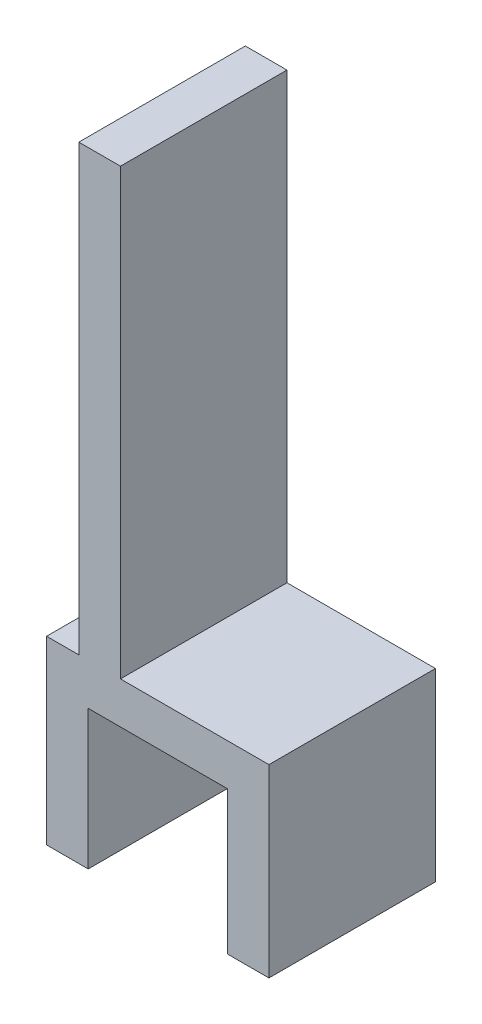
ISO-10303-21;
HEADER;
FILE_DESCRIPTION(('STEP AP214'),'2;1');
FILE_NAME('part.step','',(''),(''),'','','');
FILE_SCHEMA(('AUTOMOTIVE_DESIGN { 1 0 10303 214 1 1 1 1 }'));
ENDSEC;
DATA;
#1=APPLICATION_CONTEXT('core data for automotive mechanical design processes');
#2=APPLICATION_PROTOCOL_DEFINITION('international standard','automotive_design',2000,#1);
#3=PRODUCT_CONTEXT('',#1,'mechanical');
#4=PRODUCT('Part','Part','',(#3));
#5=PRODUCT_RELATED_PRODUCT_CATEGORY('part','',(#4));
#6=PRODUCT_DEFINITION_FORMATION('','',#4);
#7=PRODUCT_DEFINITION_CONTEXT('part definition',#1,'design');
#8=PRODUCT_DEFINITION('design','',#6,#7);
#9=PRODUCT_DEFINITION_SHAPE('','',#8);
#10=(LENGTH_UNIT() NAMED_UNIT(*) SI_UNIT(.MILLI.,.METRE.));
#11=(NAMED_UNIT(*) PLANE_ANGLE_UNIT() SI_UNIT($,.RADIAN.));
#12=(NAMED_UNIT(*) SI_UNIT($,.STERADIAN.) SOLID_ANGLE_UNIT());
#13=UNCERTAINTY_MEASURE_WITH_UNIT(LENGTH_MEASURE(1.E-05),#10,'distance_accuracy_value','');
#14=(GEOMETRIC_REPRESENTATION_CONTEXT(3) GLOBAL_UNCERTAINTY_ASSIGNED_CONTEXT((#13)) GLOBAL_UNIT_ASSIGNED_CONTEXT((#10,
#11,#12)) REPRESENTATION_CONTEXT('',''));
#15=CARTESIAN_POINT('',(0.,0.,0.));
#16=DIRECTION('',(0.,0.,1.));
#17=DIRECTION('',(1.,0.,0.));
#18=AXIS2_PLACEMENT_3D('',#15,#16,#17);
#19=CARTESIAN_POINT('',(3.00000000000001,-13.025,12.));
#20=DIRECTION('',(0.,1.,0.));
#21=DIRECTION('',(0.,0.,1.));
#22=AXIS2_PLACEMENT_3D('',#19,#20,#21);
#23=PLANE('',#22);
#24=DIRECTION('',(1.,0.,0.));
#25=VECTOR('',#24,1.);
#26=CARTESIAN_POINT('',(3.00000000000001,-13.025,0.));
#27=LINE('',#26,#25);
#28=CARTESIAN_POINT('',(0.,-13.025,0.));
#29=VERTEX_POINT('',#28);
#30=CARTESIAN_POINT('',(3.00000000000001,-13.025,0.));
#31=VERTEX_POINT('',#30);
#32=EDGE_CURVE('E156',#29,#31,#27,.T.);
#33=ORIENTED_EDGE('',*,*,#32,.T.);
#34=DIRECTION('',(0.,0.,-1.));
#35=VECTOR('',#34,1.);
#36=CARTESIAN_POINT('',(3.00000000000001,-13.025,12.));
#37=LINE('',#36,#35);
#38=CARTESIAN_POINT('',(3.00000000000001,-13.025,12.));
#39=VERTEX_POINT('',#38);
#40=EDGE_CURVE('E11',#39,#31,#37,.T.);
#41=ORIENTED_EDGE('',*,*,#40,.F.);
#42=DIRECTION('',(1.,0.,0.));
#43=VECTOR('',#42,1.);
#44=CARTESIAN_POINT('',(3.00000000000001,-13.025,12.));
#45=LINE('',#44,#43);
#46=CARTESIAN_POINT('',(0.,-13.025,12.));
#47=VERTEX_POINT('',#46);
#48=EDGE_CURVE('E178',#47,#39,#45,.T.);
#49=ORIENTED_EDGE('',*,*,#48,.F.);
#50=DIRECTION('',(0.,0.,-1.));
#51=VECTOR('',#50,1.);
#52=CARTESIAN_POINT('',(0.,-13.025,12.));
#53=LINE('',#52,#51);
#54=EDGE_CURVE('E152',#47,#29,#53,.T.);
#55=ORIENTED_EDGE('',*,*,#54,.T.);
#56=EDGE_LOOP('',(#33,#41,#49,#55));
#57=FACE_BOUND('',#56,.T.);
#58=ADVANCED_FACE('F36',(#57),#23,.F.);
#59=CARTESIAN_POINT('',(3.,-3.,12.));
#60=DIRECTION('',(-1.,0.,0.));
#61=DIRECTION('',(0.,-1.,0.));
#62=AXIS2_PLACEMENT_3D('',#59,#60,#61);
#63=PLANE('',#62);
#64=DIRECTION('',(0.,1.,0.));
#65=VECTOR('',#64,1.);
#66=CARTESIAN_POINT('',(3.,-3.,0.));
#67=LINE('',#66,#65);
#68=CARTESIAN_POINT('',(3.,-3.,0.));
#69=VERTEX_POINT('',#68);
#70=EDGE_CURVE('E159',#31,#69,#67,.T.);
#71=ORIENTED_EDGE('',*,*,#70,.T.);
#72=DIRECTION('',(0.,0.,-1.));
#73=VECTOR('',#72,1.);
#74=CARTESIAN_POINT('',(3.,-3.,12.));
#75=LINE('',#74,#73);
#76=CARTESIAN_POINT('',(3.,-3.,12.));
#77=VERTEX_POINT('',#76);
#78=EDGE_CURVE('E44',#77,#69,#75,.T.);
#79=ORIENTED_EDGE('',*,*,#78,.F.);
#80=DIRECTION('',(0.,1.,0.));
#81=VECTOR('',#80,1.);
#82=CARTESIAN_POINT('',(3.,-3.,12.));
#83=LINE('',#82,#81);
#84=EDGE_CURVE('E107',#39,#77,#83,.T.);
#85=ORIENTED_EDGE('',*,*,#84,.F.);
#86=ORIENTED_EDGE('',*,*,#40,.T.);
#87=EDGE_LOOP('',(#71,#79,#85,#86));
#88=FACE_BOUND('',#87,.T.);
#89=ADVANCED_FACE('F256',(#88),#63,.F.);
#90=CARTESIAN_POINT('',(13.025,-3.,12.));
#91=DIRECTION('',(0.,1.,0.));
#92=DIRECTION('',(-1.,0.,0.));
#93=AXIS2_PLACEMENT_3D('',#90,#91,#92);
#94=PLANE('',#93);
#95=DIRECTION('',(1.,0.,0.));
#96=VECTOR('',#95,1.);
#97=CARTESIAN_POINT('',(13.025,-3.,0.));
#98=LINE('',#97,#96);
#99=CARTESIAN_POINT('',(13.025,-3.,0.));
#100=VERTEX_POINT('',#99);
#101=EDGE_CURVE('E161',#69,#100,#98,.T.);
#102=ORIENTED_EDGE('',*,*,#101,.T.);
#103=DIRECTION('',(0.,0.,-1.));
#104=VECTOR('',#103,1.);
#105=CARTESIAN_POINT('',(13.025,-3.,12.));
#106=LINE('',#105,#104);
#107=CARTESIAN_POINT('',(13.025,-3.,12.));
#108=VERTEX_POINT('',#107);
#109=EDGE_CURVE('E197',#108,#100,#106,.T.);
#110=ORIENTED_EDGE('',*,*,#109,.F.);
#111=DIRECTION('',(1.,0.,0.));
#112=VECTOR('',#111,1.);
#113=CARTESIAN_POINT('',(13.025,-3.,12.));
#114=LINE('',#113,#112);
#115=EDGE_CURVE('E205',#77,#108,#114,.T.);
#116=ORIENTED_EDGE('',*,*,#115,.F.);
#117=ORIENTED_EDGE('',*,*,#78,.T.);
#118=EDGE_LOOP('',(#102,#110,#116,#117));
#119=FACE_BOUND('',#118,.T.);
#120=ADVANCED_FACE('F203',(#119),#94,.F.);
#121=CARTESIAN_POINT('',(13.025,-13.3169902912621,12.));
#122=DIRECTION('',(1.,0.,0.));
#123=DIRECTION('',(0.,0.,-1.));
#124=AXIS2_PLACEMENT_3D('',#121,#122,#123);
#125=PLANE('',#124);
#126=DIRECTION('',(0.,-1.,0.));
#127=VECTOR('',#126,1.);
#128=CARTESIAN_POINT('',(13.025,-13.3169902912621,0.));
#129=LINE('',#128,#127);
#130=CARTESIAN_POINT('',(13.025,-13.3169902912621,0.));
#131=VERTEX_POINT('',#130);
#132=EDGE_CURVE('E163',#100,#131,#129,.T.);
#133=ORIENTED_EDGE('',*,*,#132,.T.);
#134=DIRECTION('',(0.,0.,-1.));
#135=VECTOR('',#134,1.);
#136=CARTESIAN_POINT('',(13.025,-13.3169902912621,12.));
#137=LINE('',#136,#135);
#138=CARTESIAN_POINT('',(13.025,-13.3169902912621,12.));
#139=VERTEX_POINT('',#138);
#140=EDGE_CURVE('E194',#139,#131,#137,.T.);
#141=ORIENTED_EDGE('',*,*,#140,.F.);
#142=DIRECTION('',(0.,-1.,0.));
#143=VECTOR('',#142,1.);
#144=CARTESIAN_POINT('',(13.025,-13.3169902912621,12.));
#145=LINE('',#144,#143);
#146=EDGE_CURVE('E223',#108,#139,#145,.T.);
#147=ORIENTED_EDGE('',*,*,#146,.F.);
#148=ORIENTED_EDGE('',*,*,#109,.T.);
#149=EDGE_LOOP('',(#133,#141,#147,#148));
#150=FACE_BOUND('',#149,.T.);
#151=ADVANCED_FACE('F214',(#150),#125,.F.);
#152=CARTESIAN_POINT('',(16.025,-13.3169902912621,12.));
#153=DIRECTION('',(0.,1.,0.));
#154=DIRECTION('',(0.,0.,1.));
#155=AXIS2_PLACEMENT_3D('',#152,#153,#154);
#156=PLANE('',#155);
#157=DIRECTION('',(1.,0.,0.));
#158=VECTOR('',#157,1.);
#159=CARTESIAN_POINT('',(16.025,-13.3169902912621,0.));
#160=LINE('',#159,#158);
#161=CARTESIAN_POINT('',(16.025,-13.3169902912621,0.));
#162=VERTEX_POINT('',#161);
#163=EDGE_CURVE('E165',#131,#162,#160,.T.);
#164=ORIENTED_EDGE('',*,*,#163,.T.);
#165=DIRECTION('',(0.,0.,-1.));
#166=VECTOR('',#165,1.);
#167=CARTESIAN_POINT('',(16.025,-13.3169902912621,12.));
#168=LINE('',#167,#166);
#169=CARTESIAN_POINT('',(16.025,-13.3169902912621,12.));
#170=VERTEX_POINT('',#169);
#171=EDGE_CURVE('E191',#170,#162,#168,.T.);
#172=ORIENTED_EDGE('',*,*,#171,.F.);
#173=DIRECTION('',(1.,0.,0.));
#174=VECTOR('',#173,1.);
#175=CARTESIAN_POINT('',(16.025,-13.3169902912621,12.));
#176=LINE('',#175,#174);
#177=EDGE_CURVE('E220',#139,#170,#176,.T.);
#178=ORIENTED_EDGE('',*,*,#177,.F.);
#179=ORIENTED_EDGE('',*,*,#140,.T.);
#180=EDGE_LOOP('',(#164,#172,#178,#179));
#181=FACE_BOUND('',#180,.T.);
#182=ADVANCED_FACE('F218',(#181),#156,.F.);
#183=CARTESIAN_POINT('',(16.025,0.,12.));
#184=DIRECTION('',(-1.,0.,0.));
#185=DIRECTION('',(0.,0.,1.));
#186=AXIS2_PLACEMENT_3D('',#183,#184,#185);
#187=PLANE('',#186);
#188=DIRECTION('',(0.,1.,0.));
#189=VECTOR('',#188,1.);
#190=CARTESIAN_POINT('',(16.025,0.,0.));
#191=LINE('',#190,#189);
#192=CARTESIAN_POINT('',(16.025,0.,0.));
#193=VERTEX_POINT('',#192);
#194=EDGE_CURVE('E167',#162,#193,#191,.T.);
#195=ORIENTED_EDGE('',*,*,#194,.T.);
#196=DIRECTION('',(0.,0.,-1.));
#197=VECTOR('',#196,1.);
#198=CARTESIAN_POINT('',(16.025,0.,12.));
#199=LINE('',#198,#197);
#200=CARTESIAN_POINT('',(16.025,0.,12.));
#201=VERTEX_POINT('',#200);
#202=EDGE_CURVE('E188',#201,#193,#199,.T.);
#203=ORIENTED_EDGE('',*,*,#202,.F.);
#204=DIRECTION('',(0.,1.,0.));
#205=VECTOR('',#204,1.);
#206=CARTESIAN_POINT('',(16.025,0.,12.));
#207=LINE('',#206,#205);
#208=EDGE_CURVE('E222',#170,#201,#207,.T.);
#209=ORIENTED_EDGE('',*,*,#208,.F.);
#210=ORIENTED_EDGE('',*,*,#171,.T.);
#211=EDGE_LOOP('',(#195,#203,#209,#210));
#212=FACE_BOUND('',#211,.T.);
#213=ADVANCED_FACE('F269',(#212),#187,.F.);
#214=CARTESIAN_POINT('',(5.32499999999999,0.,12.));
#215=DIRECTION('',(0.,-1.,0.));
#216=DIRECTION('',(0.,0.,-1.));
#217=AXIS2_PLACEMENT_3D('',#214,#215,#216);
#218=PLANE('',#217);
#219=DIRECTION('',(-1.,0.,0.));
#220=VECTOR('',#219,1.);
#221=CARTESIAN_POINT('',(5.32499999999999,0.,0.));
#222=LINE('',#221,#220);
#223=CARTESIAN_POINT('',(5.32499999999999,0.,0.));
#224=VERTEX_POINT('',#223);
#225=EDGE_CURVE('E169',#193,#224,#222,.T.);
#226=ORIENTED_EDGE('',*,*,#225,.T.);
#227=DIRECTION('',(0.,0.,-1.));
#228=VECTOR('',#227,1.);
#229=CARTESIAN_POINT('',(5.32499999999999,0.,12.));
#230=LINE('',#229,#228);
#231=CARTESIAN_POINT('',(5.32499999999999,0.,12.));
#232=VERTEX_POINT('',#231);
#233=EDGE_CURVE('E185',#232,#224,#230,.T.);
#234=ORIENTED_EDGE('',*,*,#233,.F.);
#235=DIRECTION('',(-1.,0.,0.));
#236=VECTOR('',#235,1.);
#237=CARTESIAN_POINT('',(5.32499999999999,0.,12.));
#238=LINE('',#237,#236);
#239=EDGE_CURVE('E225',#201,#232,#238,.T.);
#240=ORIENTED_EDGE('',*,*,#239,.F.);
#241=ORIENTED_EDGE('',*,*,#202,.T.);
#242=EDGE_LOOP('',(#226,#234,#240,#241));
#243=FACE_BOUND('',#242,.T.);
#244=ADVANCED_FACE('F272',(#243),#218,.F.);
#245=CARTESIAN_POINT('',(5.32499999999999,32.,12.));
#246=DIRECTION('',(-1.,0.,0.));
#247=DIRECTION('',(0.,-1.,0.));
#248=AXIS2_PLACEMENT_3D('',#245,#246,#247);
#249=PLANE('',#248);
#250=DIRECTION('',(0.,1.,0.));
#251=VECTOR('',#250,1.);
#252=CARTESIAN_POINT('',(5.32499999999999,32.,0.));
#253=LINE('',#252,#251);
#254=CARTESIAN_POINT('',(5.32499999999999,32.,0.));
#255=VERTEX_POINT('',#254);
#256=EDGE_CURVE('E171',#224,#255,#253,.T.);
#257=ORIENTED_EDGE('',*,*,#256,.T.);
#258=DIRECTION('',(0.,0.,-1.));
#259=VECTOR('',#258,1.);
#260=CARTESIAN_POINT('',(5.32499999999999,32.,12.));
#261=LINE('',#260,#259);
#262=CARTESIAN_POINT('',(5.32499999999999,32.,12.));
#263=VERTEX_POINT('',#262);
#264=EDGE_CURVE('E182',#263,#255,#261,.T.);
#265=ORIENTED_EDGE('',*,*,#264,.F.);
#266=DIRECTION('',(0.,1.,0.));
#267=VECTOR('',#266,1.);
#268=CARTESIAN_POINT('',(5.32499999999999,32.,12.));
#269=LINE('',#268,#267);
#270=EDGE_CURVE('E231',#232,#263,#269,.T.);
#271=ORIENTED_EDGE('',*,*,#270,.F.);
#272=ORIENTED_EDGE('',*,*,#233,.T.);
#273=EDGE_LOOP('',(#257,#265,#271,#272));
#274=FACE_BOUND('',#273,.T.);
#275=ADVANCED_FACE('F237',(#274),#249,.F.);
#276=CARTESIAN_POINT('',(2.32499999999999,32.,12.));
#277=DIRECTION('',(0.,-1.,0.));
#278=DIRECTION('',(0.,0.,-1.));
#279=AXIS2_PLACEMENT_3D('',#276,#277,#278);
#280=PLANE('',#279);
#281=DIRECTION('',(-1.,0.,0.));
#282=VECTOR('',#281,1.);
#283=CARTESIAN_POINT('',(2.32499999999999,32.,0.));
#284=LINE('',#283,#282);
#285=CARTESIAN_POINT('',(2.32499999999999,32.,0.));
#286=VERTEX_POINT('',#285);
#287=EDGE_CURVE('E173',#255,#286,#284,.T.);
#288=ORIENTED_EDGE('',*,*,#287,.T.);
#289=DIRECTION('',(0.,0.,-1.));
#290=VECTOR('',#289,1.);
#291=CARTESIAN_POINT('',(2.32499999999999,32.,12.));
#292=LINE('',#291,#290);
#293=CARTESIAN_POINT('',(2.32499999999999,32.,12.));
#294=VERTEX_POINT('',#293);
#295=EDGE_CURVE('E147',#294,#286,#292,.T.);
#296=ORIENTED_EDGE('',*,*,#295,.F.);
#297=DIRECTION('',(-1.,0.,0.));
#298=VECTOR('',#297,1.);
#299=CARTESIAN_POINT('',(2.32499999999999,32.,12.));
#300=LINE('',#299,#298);
#301=EDGE_CURVE('E138',#263,#294,#300,.T.);
#302=ORIENTED_EDGE('',*,*,#301,.F.);
#303=ORIENTED_EDGE('',*,*,#264,.T.);
#304=EDGE_LOOP('',(#288,#296,#302,#303));
#305=FACE_BOUND('',#304,.T.);
#306=ADVANCED_FACE('F241',(#305),#280,.F.);
#307=CARTESIAN_POINT('',(2.32499999999999,0.,12.));
#308=DIRECTION('',(1.,0.,0.));
#309=DIRECTION('',(0.,0.,-1.));
#310=AXIS2_PLACEMENT_3D('',#307,#308,#309);
#311=PLANE('',#310);
#312=DIRECTION('',(0.,-1.,0.));
#313=VECTOR('',#312,1.);
#314=CARTESIAN_POINT('',(2.32499999999999,0.,0.));
#315=LINE('',#314,#313);
#316=CARTESIAN_POINT('',(2.32499999999999,0.,0.));
#317=VERTEX_POINT('',#316);
#318=EDGE_CURVE('E146',#286,#317,#315,.T.);
#319=ORIENTED_EDGE('',*,*,#318,.T.);
#320=DIRECTION('',(0.,0.,-1.));
#321=VECTOR('',#320,1.);
#322=CARTESIAN_POINT('',(2.32499999999999,0.,12.));
#323=LINE('',#322,#321);
#324=CARTESIAN_POINT('',(2.32499999999999,0.,12.));
#325=VERTEX_POINT('',#324);
#326=EDGE_CURVE('E143',#325,#317,#323,.T.);
#327=ORIENTED_EDGE('',*,*,#326,.F.);
#328=DIRECTION('',(0.,-1.,0.));
#329=VECTOR('',#328,1.);
#330=CARTESIAN_POINT('',(2.32499999999999,0.,12.));
#331=LINE('',#330,#329);
#332=EDGE_CURVE('E132',#294,#325,#331,.T.);
#333=ORIENTED_EDGE('',*,*,#332,.F.);
#334=ORIENTED_EDGE('',*,*,#295,.T.);
#335=EDGE_LOOP('',(#319,#327,#333,#334));
#336=FACE_BOUND('',#335,.T.);
#337=ADVANCED_FACE('F144',(#336),#311,.F.);
#338=CARTESIAN_POINT('',(0.,0.,12.));
#339=DIRECTION('',(0.,-1.,0.));
#340=DIRECTION('',(0.,0.,-1.));
#341=AXIS2_PLACEMENT_3D('',#338,#339,#340);
#342=PLANE('',#341);
#343=DIRECTION('',(-1.,0.,0.));
#344=VECTOR('',#343,1.);
#345=CARTESIAN_POINT('',(0.,0.,0.));
#346=LINE('',#345,#344);
#347=CARTESIAN_POINT('',(0.,0.,0.));
#348=VERTEX_POINT('',#347);
#349=EDGE_CURVE('E93',#317,#348,#346,.T.);
#350=ORIENTED_EDGE('',*,*,#349,.T.);
#351=DIRECTION('',(0.,0.,-1.));
#352=VECTOR('',#351,1.);
#353=CARTESIAN_POINT('',(0.,0.,12.));
#354=LINE('',#353,#352);
#355=CARTESIAN_POINT('',(0.,0.,12.));
#356=VERTEX_POINT('',#355);
#357=EDGE_CURVE('E148',#356,#348,#354,.T.);
#358=ORIENTED_EDGE('',*,*,#357,.F.);
#359=DIRECTION('',(-1.,0.,0.));
#360=VECTOR('',#359,1.);
#361=CARTESIAN_POINT('',(0.,0.,12.));
#362=LINE('',#361,#360);
#363=EDGE_CURVE('E136',#325,#356,#362,.T.);
#364=ORIENTED_EDGE('',*,*,#363,.F.);
#365=ORIENTED_EDGE('',*,*,#326,.T.);
#366=EDGE_LOOP('',(#350,#358,#364,#365));
#367=FACE_BOUND('',#366,.T.);
#368=ADVANCED_FACE('F150',(#367),#342,.F.);
#369=CARTESIAN_POINT('',(0.,-13.025,12.));
#370=DIRECTION('',(1.,0.,0.));
#371=DIRECTION('',(0.,1.,0.));
#372=AXIS2_PLACEMENT_3D('',#369,#370,#371);
#373=PLANE('',#372);
#374=DIRECTION('',(0.,-1.,0.));
#375=VECTOR('',#374,1.);
#376=CARTESIAN_POINT('',(0.,-13.025,0.));
#377=LINE('',#376,#375);
#378=EDGE_CURVE('E99',#348,#29,#377,.T.);
#379=ORIENTED_EDGE('',*,*,#378,.T.);
#380=ORIENTED_EDGE('',*,*,#54,.F.);
#381=DIRECTION('',(0.,-1.,0.));
#382=VECTOR('',#381,1.);
#383=CARTESIAN_POINT('',(0.,-13.025,12.));
#384=LINE('',#383,#382);
#385=EDGE_CURVE('E52',#356,#47,#384,.T.);
#386=ORIENTED_EDGE('',*,*,#385,.F.);
#387=ORIENTED_EDGE('',*,*,#357,.T.);
#388=EDGE_LOOP('',(#379,#380,#386,#387));
#389=FACE_BOUND('',#388,.T.);
#390=ADVANCED_FACE('F245',(#389),#373,.F.);
#391=CARTESIAN_POINT('',(0.,0.,12.));
#392=DIRECTION('',(0.,0.,-1.));
#393=DIRECTION('',(-1.,0.,0.));
#394=AXIS2_PLACEMENT_3D('',#391,#392,#393);
#395=PLANE('',#394);
#396=ORIENTED_EDGE('',*,*,#48,.T.);
#397=ORIENTED_EDGE('',*,*,#84,.T.);
#398=ORIENTED_EDGE('',*,*,#115,.T.);
#399=ORIENTED_EDGE('',*,*,#146,.T.);
#400=ORIENTED_EDGE('',*,*,#177,.T.);
#401=ORIENTED_EDGE('',*,*,#208,.T.);
#402=ORIENTED_EDGE('',*,*,#239,.T.);
#403=ORIENTED_EDGE('',*,*,#270,.T.);
#404=ORIENTED_EDGE('',*,*,#301,.T.);
#405=ORIENTED_EDGE('',*,*,#332,.T.);
#406=ORIENTED_EDGE('',*,*,#363,.T.);
#407=ORIENTED_EDGE('',*,*,#385,.T.);
#408=EDGE_LOOP('',(#396,#397,#398,#399,#400,#401,#402,#403,#404,#405,#406,#407));
#409=FACE_BOUND('',#408,.T.);
#410=ADVANCED_FACE('F134',(#409),#395,.F.);
#411=CARTESIAN_POINT('',(0.,0.,0.));
#412=DIRECTION('',(0.,0.,-1.));
#413=DIRECTION('',(-1.,0.,0.));
#414=AXIS2_PLACEMENT_3D('',#411,#412,#413);
#415=PLANE('',#414);
#416=ORIENTED_EDGE('',*,*,#32,.F.);
#417=ORIENTED_EDGE('',*,*,#378,.F.);
#418=ORIENTED_EDGE('',*,*,#349,.F.);
#419=ORIENTED_EDGE('',*,*,#318,.F.);
#420=ORIENTED_EDGE('',*,*,#287,.F.);
#421=ORIENTED_EDGE('',*,*,#256,.F.);
#422=ORIENTED_EDGE('',*,*,#225,.F.);
#423=ORIENTED_EDGE('',*,*,#194,.F.);
#424=ORIENTED_EDGE('',*,*,#163,.F.);
#425=ORIENTED_EDGE('',*,*,#132,.F.);
#426=ORIENTED_EDGE('',*,*,#101,.F.);
#427=ORIENTED_EDGE('',*,*,#70,.F.);
#428=EDGE_LOOP('',(#416,#417,#418,#419,#420,#421,#422,#423,#424,#425,#426,#427));
#429=FACE_BOUND('',#428,.T.);
#430=ADVANCED_FACE('F209',(#429),#415,.T.);
#431=CLOSED_SHELL('',(#58,#89,#120,#151,#182,#213,#244,#275,#306,#337,#368,#390,#410,#430));
#432=MANIFOLD_SOLID_BREP('B2',#431);
#433=ADVANCED_BREP_SHAPE_REPRESENTATION('',(#18,#432),#14);
#434=SHAPE_DEFINITION_REPRESENTATION(#9,#433);
ENDSEC;
END-ISO-10303-21;
